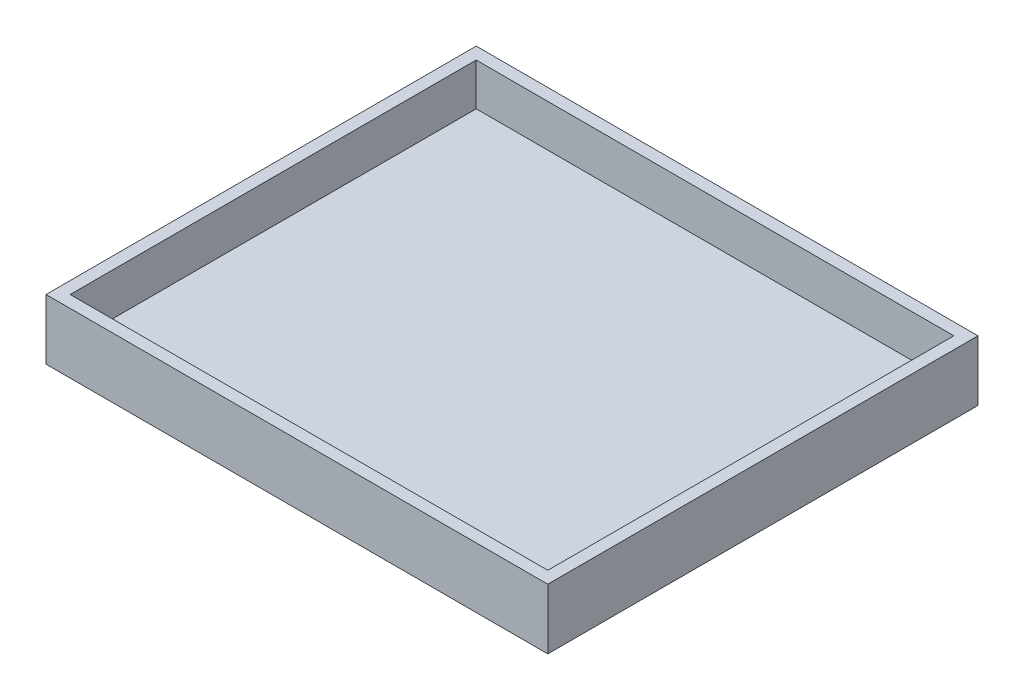
ISO-10303-21;
HEADER;
FILE_DESCRIPTION(('STEP AP214'),'2;1');
FILE_NAME('part.step','',(''),(''),'','','');
FILE_SCHEMA(('AUTOMOTIVE_DESIGN { 1 0 10303 214 1 1 1 1 }'));
ENDSEC;
DATA;
#1=APPLICATION_CONTEXT('core data for automotive mechanical design processes');
#2=APPLICATION_PROTOCOL_DEFINITION('international standard','automotive_design',2000,#1);
#3=PRODUCT_CONTEXT('',#1,'mechanical');
#4=PRODUCT('Part','Part','',(#3));
#5=PRODUCT_RELATED_PRODUCT_CATEGORY('part','',(#4));
#6=PRODUCT_DEFINITION_FORMATION('','',#4);
#7=PRODUCT_DEFINITION_CONTEXT('part definition',#1,'design');
#8=PRODUCT_DEFINITION('design','',#6,#7);
#9=PRODUCT_DEFINITION_SHAPE('','',#8);
#10=(LENGTH_UNIT() NAMED_UNIT(*) SI_UNIT(.MILLI.,.METRE.));
#11=(NAMED_UNIT(*) PLANE_ANGLE_UNIT() SI_UNIT($,.RADIAN.));
#12=(NAMED_UNIT(*) SI_UNIT($,.STERADIAN.) SOLID_ANGLE_UNIT());
#13=UNCERTAINTY_MEASURE_WITH_UNIT(LENGTH_MEASURE(1.E-05),#10,'distance_accuracy_value','');
#14=(GEOMETRIC_REPRESENTATION_CONTEXT(3) GLOBAL_UNCERTAINTY_ASSIGNED_CONTEXT((#13)) GLOBAL_UNIT_ASSIGNED_CONTEXT((#10,
#11,#12)) REPRESENTATION_CONTEXT('',''));
#15=CARTESIAN_POINT('',(0.,0.,0.));
#16=DIRECTION('',(0.,0.,1.));
#17=DIRECTION('',(1.,0.,0.));
#18=AXIS2_PLACEMENT_3D('',#15,#16,#17);
#19=CARTESIAN_POINT('',(41.57,10.,-35.6407880220646));
#20=DIRECTION('',(-1.,0.,0.));
#21=DIRECTION('',(0.,0.,1.));
#22=AXIS2_PLACEMENT_3D('',#19,#20,#21);
#23=PLANE('',#22);
#24=DIRECTION('',(0.,0.,-1.));
#25=VECTOR('',#24,1.);
#26=CARTESIAN_POINT('',(41.57,0.,-35.6407880220646));
#27=LINE('',#26,#25);
#28=CARTESIAN_POINT('',(41.57,0.,35.6407880220646));
#29=VERTEX_POINT('',#28);
#30=CARTESIAN_POINT('',(41.57,0.,-35.6407880220646));
#31=VERTEX_POINT('',#30);
#32=EDGE_CURVE('E146',#29,#31,#27,.T.);
#33=ORIENTED_EDGE('',*,*,#32,.T.);
#34=DIRECTION('',(0.,-1.,0.));
#35=VECTOR('',#34,1.);
#36=CARTESIAN_POINT('',(41.57,10.,-35.6407880220646));
#37=LINE('',#36,#35);
#38=CARTESIAN_POINT('',(41.57,10.,-35.6407880220646));
#39=VERTEX_POINT('',#38);
#40=EDGE_CURVE('E11',#39,#31,#37,.T.);
#41=ORIENTED_EDGE('',*,*,#40,.F.);
#42=DIRECTION('',(0.,0.,-1.));
#43=VECTOR('',#42,1.);
#44=CARTESIAN_POINT('',(41.57,10.,-35.6407880220646));
#45=LINE('',#44,#43);
#46=CARTESIAN_POINT('',(41.57,10.,35.6407880220646));
#47=VERTEX_POINT('',#46);
#48=EDGE_CURVE('E150',#47,#39,#45,.T.);
#49=ORIENTED_EDGE('',*,*,#48,.F.);
#50=DIRECTION('',(0.,-1.,0.));
#51=VECTOR('',#50,1.);
#52=CARTESIAN_POINT('',(41.57,10.,35.6407880220646));
#53=LINE('',#52,#51);
#54=EDGE_CURVE('E156',#47,#29,#53,.T.);
#55=ORIENTED_EDGE('',*,*,#54,.T.);
#56=EDGE_LOOP('',(#33,#41,#49,#55));
#57=FACE_BOUND('',#56,.T.);
#58=ADVANCED_FACE('F38',(#57),#23,.F.);
#59=CARTESIAN_POINT('',(-41.57,10.,-35.6407880220646));
#60=DIRECTION('',(0.,0.,1.));
#61=DIRECTION('',(1.,0.,0.));
#62=AXIS2_PLACEMENT_3D('',#59,#60,#61);
#63=PLANE('',#62);
#64=DIRECTION('',(-1.,0.,0.));
#65=VECTOR('',#64,1.);
#66=CARTESIAN_POINT('',(-41.57,0.,-35.6407880220646));
#67=LINE('',#66,#65);
#68=CARTESIAN_POINT('',(-41.57,0.,-35.6407880220646));
#69=VERTEX_POINT('',#68);
#70=EDGE_CURVE('E159',#31,#69,#67,.T.);
#71=ORIENTED_EDGE('',*,*,#70,.T.);
#72=DIRECTION('',(0.,-1.,0.));
#73=VECTOR('',#72,1.);
#74=CARTESIAN_POINT('',(-41.57,10.,-35.6407880220646));
#75=LINE('',#74,#73);
#76=CARTESIAN_POINT('',(-41.57,10.,-35.6407880220646));
#77=VERTEX_POINT('',#76);
#78=EDGE_CURVE('E45',#77,#69,#75,.T.);
#79=ORIENTED_EDGE('',*,*,#78,.F.);
#80=DIRECTION('',(-1.,0.,0.));
#81=VECTOR('',#80,1.);
#82=CARTESIAN_POINT('',(-41.57,10.,-35.6407880220646));
#83=LINE('',#82,#81);
#84=EDGE_CURVE('E89',#39,#77,#83,.T.);
#85=ORIENTED_EDGE('',*,*,#84,.F.);
#86=ORIENTED_EDGE('',*,*,#40,.T.);
#87=EDGE_LOOP('',(#71,#79,#85,#86));
#88=FACE_BOUND('',#87,.T.);
#89=ADVANCED_FACE('F188',(#88),#63,.F.);
#90=CARTESIAN_POINT('',(-41.57,10.,-35.6407880220646));
#91=DIRECTION('',(1.,0.,0.));
#92=DIRECTION('',(0.,0.,-1.));
#93=AXIS2_PLACEMENT_3D('',#90,#91,#92);
#94=PLANE('',#93);
#95=DIRECTION('',(0.,0.,1.));
#96=VECTOR('',#95,1.);
#97=CARTESIAN_POINT('',(-41.57,0.,-35.6407880220646));
#98=LINE('',#97,#96);
#99=CARTESIAN_POINT('',(-41.57,0.,35.6407880220646));
#100=VERTEX_POINT('',#99);
#101=EDGE_CURVE('E161',#69,#100,#98,.T.);
#102=ORIENTED_EDGE('',*,*,#101,.T.);
#103=DIRECTION('',(0.,-1.,0.));
#104=VECTOR('',#103,1.);
#105=CARTESIAN_POINT('',(-41.57,10.,35.6407880220646));
#106=LINE('',#105,#104);
#107=CARTESIAN_POINT('',(-41.57,10.,35.6407880220646));
#108=VERTEX_POINT('',#107);
#109=EDGE_CURVE('E165',#108,#100,#106,.T.);
#110=ORIENTED_EDGE('',*,*,#109,.F.);
#111=DIRECTION('',(0.,0.,1.));
#112=VECTOR('',#111,1.);
#113=CARTESIAN_POINT('',(-41.57,10.,-35.6407880220646));
#114=LINE('',#113,#112);
#115=EDGE_CURVE('E153',#77,#108,#114,.T.);
#116=ORIENTED_EDGE('',*,*,#115,.F.);
#117=ORIENTED_EDGE('',*,*,#78,.T.);
#118=EDGE_LOOP('',(#102,#110,#116,#117));
#119=FACE_BOUND('',#118,.T.);
#120=ADVANCED_FACE('F170',(#119),#94,.F.);
#121=CARTESIAN_POINT('',(-41.57,10.,35.6407880220646));
#122=DIRECTION('',(0.,0.,-1.));
#123=DIRECTION('',(-1.,0.,0.));
#124=AXIS2_PLACEMENT_3D('',#121,#122,#123);
#125=PLANE('',#124);
#126=DIRECTION('',(1.,0.,0.));
#127=VECTOR('',#126,1.);
#128=CARTESIAN_POINT('',(-41.57,0.,35.6407880220646));
#129=LINE('',#128,#127);
#130=EDGE_CURVE('E82',#100,#29,#129,.T.);
#131=ORIENTED_EDGE('',*,*,#130,.T.);
#132=ORIENTED_EDGE('',*,*,#54,.F.);
#133=DIRECTION('',(1.,0.,0.));
#134=VECTOR('',#133,1.);
#135=CARTESIAN_POINT('',(-41.57,10.,35.6407880220646));
#136=LINE('',#135,#134);
#137=EDGE_CURVE('E61',#108,#47,#136,.T.);
#138=ORIENTED_EDGE('',*,*,#137,.F.);
#139=ORIENTED_EDGE('',*,*,#109,.T.);
#140=EDGE_LOOP('',(#131,#132,#138,#139));
#141=FACE_BOUND('',#140,.T.);
#142=ADVANCED_FACE('F178',(#141),#125,.F.);
#143=CARTESIAN_POINT('',(0.,10.,0.));
#144=DIRECTION('',(0.,1.,0.));
#145=DIRECTION('',(0.,0.,1.));
#146=AXIS2_PLACEMENT_3D('',#143,#144,#145);
#147=PLANE('',#146);
#148=DIRECTION('',(0.,0.,-1.));
#149=VECTOR('',#148,1.);
#150=CARTESIAN_POINT('',(39.57,10.,-33.6407880220646));
#151=LINE('',#150,#149);
#152=CARTESIAN_POINT('',(39.57,10.,33.6407880220646));
#153=VERTEX_POINT('',#152);
#154=CARTESIAN_POINT('',(39.57,10.,-33.6407880220646));
#155=VERTEX_POINT('',#154);
#156=EDGE_CURVE('E52',#153,#155,#151,.T.);
#157=ORIENTED_EDGE('',*,*,#156,.F.);
#158=DIRECTION('',(1.,0.,0.));
#159=VECTOR('',#158,1.);
#160=CARTESIAN_POINT('',(-39.57,10.,33.6407880220646));
#161=LINE('',#160,#159);
#162=CARTESIAN_POINT('',(-39.57,10.,33.6407880220646));
#163=VERTEX_POINT('',#162);
#164=EDGE_CURVE('E131',#163,#153,#161,.T.);
#165=ORIENTED_EDGE('',*,*,#164,.F.);
#166=DIRECTION('',(0.,0.,1.));
#167=VECTOR('',#166,1.);
#168=CARTESIAN_POINT('',(-39.57,10.,-33.6407880220646));
#169=LINE('',#168,#167);
#170=CARTESIAN_POINT('',(-39.57,10.,-33.6407880220646));
#171=VERTEX_POINT('',#170);
#172=EDGE_CURVE('E134',#171,#163,#169,.T.);
#173=ORIENTED_EDGE('',*,*,#172,.F.);
#174=DIRECTION('',(-1.,0.,0.));
#175=VECTOR('',#174,1.);
#176=CARTESIAN_POINT('',(-39.57,10.,-33.6407880220646));
#177=LINE('',#176,#175);
#178=EDGE_CURVE('E140',#155,#171,#177,.T.);
#179=ORIENTED_EDGE('',*,*,#178,.F.);
#180=EDGE_LOOP('',(#157,#165,#173,#179));
#181=FACE_BOUND('',#180,.T.);
#182=ORIENTED_EDGE('',*,*,#48,.T.);
#183=ORIENTED_EDGE('',*,*,#84,.T.);
#184=ORIENTED_EDGE('',*,*,#115,.T.);
#185=ORIENTED_EDGE('',*,*,#137,.T.);
#186=EDGE_LOOP('',(#182,#183,#184,#185));
#187=FACE_BOUND('',#186,.T.);
#188=ADVANCED_FACE('F180',(#181,#187),#147,.T.);
#189=CARTESIAN_POINT('',(0.,0.,0.));
#190=DIRECTION('',(0.,1.,0.));
#191=DIRECTION('',(0.,0.,1.));
#192=AXIS2_PLACEMENT_3D('',#189,#190,#191);
#193=PLANE('',#192);
#194=ORIENTED_EDGE('',*,*,#32,.F.);
#195=ORIENTED_EDGE('',*,*,#130,.F.);
#196=ORIENTED_EDGE('',*,*,#101,.F.);
#197=ORIENTED_EDGE('',*,*,#70,.F.);
#198=EDGE_LOOP('',(#194,#195,#196,#197));
#199=FACE_BOUND('',#198,.T.);
#200=ADVANCED_FACE('F174',(#199),#193,.F.);
#201=CARTESIAN_POINT('',(39.57,3.,-33.6407880220646));
#202=DIRECTION('',(1.,0.,0.));
#203=DIRECTION('',(0.,0.,-1.));
#204=AXIS2_PLACEMENT_3D('',#201,#202,#203);
#205=PLANE('',#204);
#206=ORIENTED_EDGE('',*,*,#156,.T.);
#207=DIRECTION('',(0.,1.,0.));
#208=VECTOR('',#207,1.);
#209=CARTESIAN_POINT('',(39.57,3.,-33.6407880220646));
#210=LINE('',#209,#208);
#211=CARTESIAN_POINT('',(39.57,3.,-33.6407880220646));
#212=VERTEX_POINT('',#211);
#213=EDGE_CURVE('E109',#212,#155,#210,.T.);
#214=ORIENTED_EDGE('',*,*,#213,.F.);
#215=DIRECTION('',(0.,0.,-1.));
#216=VECTOR('',#215,1.);
#217=CARTESIAN_POINT('',(39.57,3.,-33.6407880220646));
#218=LINE('',#217,#216);
#219=CARTESIAN_POINT('',(39.57,3.,33.6407880220646));
#220=VERTEX_POINT('',#219);
#221=EDGE_CURVE('E113',#220,#212,#218,.T.);
#222=ORIENTED_EDGE('',*,*,#221,.F.);
#223=DIRECTION('',(0.,1.,0.));
#224=VECTOR('',#223,1.);
#225=CARTESIAN_POINT('',(39.57,3.,33.6407880220646));
#226=LINE('',#225,#224);
#227=EDGE_CURVE('E144',#220,#153,#226,.T.);
#228=ORIENTED_EDGE('',*,*,#227,.T.);
#229=EDGE_LOOP('',(#206,#214,#222,#228));
#230=FACE_BOUND('',#229,.T.);
#231=ADVANCED_FACE('F111',(#230),#205,.F.);
#232=CARTESIAN_POINT('',(-39.57,3.,33.6407880220646));
#233=DIRECTION('',(0.,0.,1.));
#234=DIRECTION('',(1.,0.,0.));
#235=AXIS2_PLACEMENT_3D('',#232,#233,#234);
#236=PLANE('',#235);
#237=ORIENTED_EDGE('',*,*,#164,.T.);
#238=ORIENTED_EDGE('',*,*,#227,.F.);
#239=DIRECTION('',(1.,0.,0.));
#240=VECTOR('',#239,1.);
#241=CARTESIAN_POINT('',(-39.57,3.,33.6407880220646));
#242=LINE('',#241,#240);
#243=CARTESIAN_POINT('',(-39.57,3.,33.6407880220646));
#244=VERTEX_POINT('',#243);
#245=EDGE_CURVE('E119',#244,#220,#242,.T.);
#246=ORIENTED_EDGE('',*,*,#245,.F.);
#247=DIRECTION('',(0.,1.,0.));
#248=VECTOR('',#247,1.);
#249=CARTESIAN_POINT('',(-39.57,3.,33.6407880220646));
#250=LINE('',#249,#248);
#251=EDGE_CURVE('E147',#244,#163,#250,.T.);
#252=ORIENTED_EDGE('',*,*,#251,.T.);
#253=EDGE_LOOP('',(#237,#238,#246,#252));
#254=FACE_BOUND('',#253,.T.);
#255=ADVANCED_FACE('F227',(#254),#236,.F.);
#256=CARTESIAN_POINT('',(-39.57,3.,-33.6407880220646));
#257=DIRECTION('',(-1.,0.,0.));
#258=DIRECTION('',(0.,0.,1.));
#259=AXIS2_PLACEMENT_3D('',#256,#257,#258);
#260=PLANE('',#259);
#261=ORIENTED_EDGE('',*,*,#172,.T.);
#262=ORIENTED_EDGE('',*,*,#251,.F.);
#263=DIRECTION('',(0.,0.,1.));
#264=VECTOR('',#263,1.);
#265=CARTESIAN_POINT('',(-39.57,3.,-33.6407880220646));
#266=LINE('',#265,#264);
#267=CARTESIAN_POINT('',(-39.57,3.,-33.6407880220646));
#268=VERTEX_POINT('',#267);
#269=EDGE_CURVE('E127',#268,#244,#266,.T.);
#270=ORIENTED_EDGE('',*,*,#269,.F.);
#271=DIRECTION('',(0.,1.,0.));
#272=VECTOR('',#271,1.);
#273=CARTESIAN_POINT('',(-39.57,3.,-33.6407880220646));
#274=LINE('',#273,#272);
#275=EDGE_CURVE('E118',#268,#171,#274,.T.);
#276=ORIENTED_EDGE('',*,*,#275,.T.);
#277=EDGE_LOOP('',(#261,#262,#270,#276));
#278=FACE_BOUND('',#277,.T.);
#279=ADVANCED_FACE('F236',(#278),#260,.F.);
#280=CARTESIAN_POINT('',(-39.57,3.,-33.6407880220646));
#281=DIRECTION('',(0.,0.,-1.));
#282=DIRECTION('',(-1.,0.,0.));
#283=AXIS2_PLACEMENT_3D('',#280,#281,#282);
#284=PLANE('',#283);
#285=ORIENTED_EDGE('',*,*,#178,.T.);
#286=ORIENTED_EDGE('',*,*,#275,.F.);
#287=DIRECTION('',(-1.,0.,0.));
#288=VECTOR('',#287,1.);
#289=CARTESIAN_POINT('',(-39.57,3.,-33.6407880220646));
#290=LINE('',#289,#288);
#291=EDGE_CURVE('E122',#212,#268,#290,.T.);
#292=ORIENTED_EDGE('',*,*,#291,.F.);
#293=ORIENTED_EDGE('',*,*,#213,.T.);
#294=EDGE_LOOP('',(#285,#286,#292,#293));
#295=FACE_BOUND('',#294,.T.);
#296=ADVANCED_FACE('F123',(#295),#284,.F.);
#297=CARTESIAN_POINT('',(0.,3.,0.));
#298=DIRECTION('',(0.,1.,0.));
#299=DIRECTION('',(0.,0.,1.));
#300=AXIS2_PLACEMENT_3D('',#297,#298,#299);
#301=PLANE('',#300);
#302=ORIENTED_EDGE('',*,*,#221,.T.);
#303=ORIENTED_EDGE('',*,*,#291,.T.);
#304=ORIENTED_EDGE('',*,*,#269,.T.);
#305=ORIENTED_EDGE('',*,*,#245,.T.);
#306=EDGE_LOOP('',(#302,#303,#304,#305));
#307=FACE_BOUND('',#306,.T.);
#308=ADVANCED_FACE('F129',(#307),#301,.T.);
#309=CLOSED_SHELL('',(#58,#89,#120,#142,#188,#200,#231,#255,#279,#296,#308));
#310=MANIFOLD_SOLID_BREP('B2',#309);
#311=ADVANCED_BREP_SHAPE_REPRESENTATION('',(#18,#310),#14);
#312=SHAPE_DEFINITION_REPRESENTATION(#9,#311);
ENDSEC;
END-ISO-10303-21;
